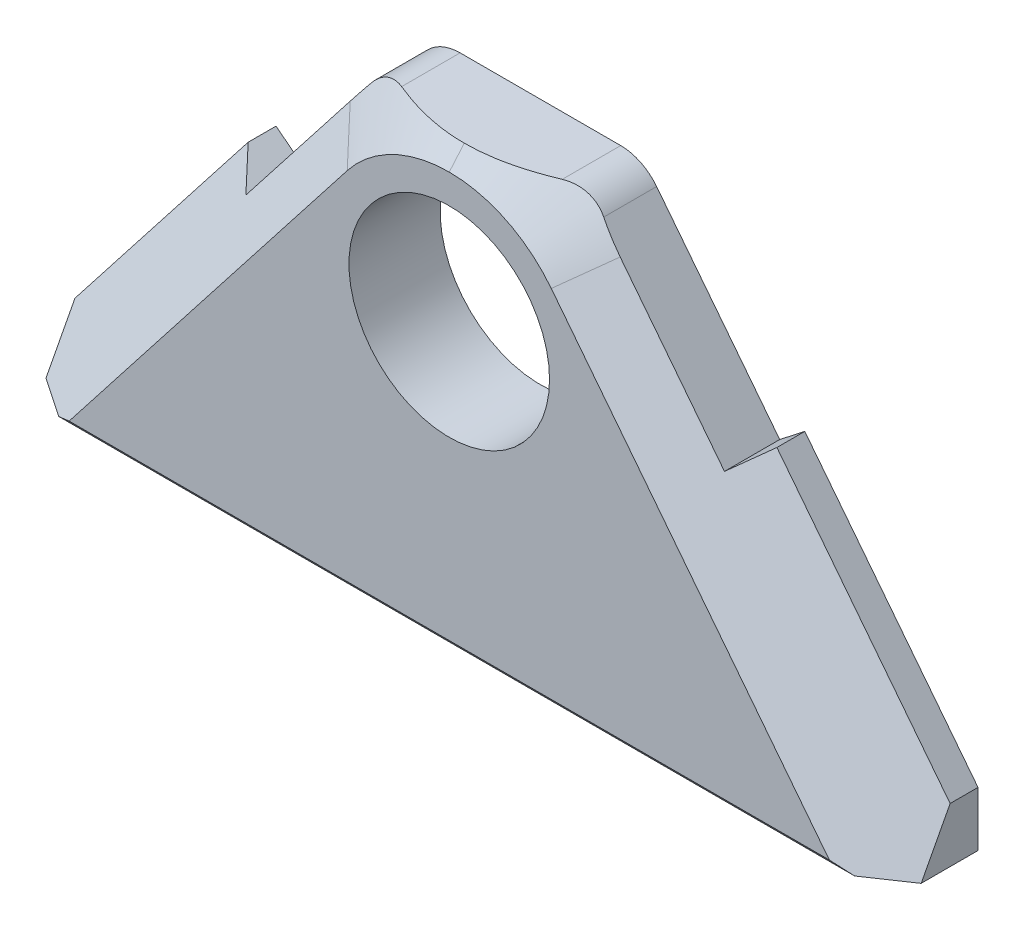
ISO-10303-21;
HEADER;
FILE_DESCRIPTION(('STEP AP214'),'2;1');
FILE_NAME('part.step','',(''),(''),'','','');
FILE_SCHEMA(('AUTOMOTIVE_DESIGN { 1 0 10303 214 1 1 1 1 }'));
ENDSEC;
DATA;
#1=APPLICATION_CONTEXT('core data for automotive mechanical design processes');
#2=APPLICATION_PROTOCOL_DEFINITION('international standard','automotive_design',2000,#1);
#3=PRODUCT_CONTEXT('',#1,'mechanical');
#4=PRODUCT('Part','Part','',(#3));
#5=PRODUCT_RELATED_PRODUCT_CATEGORY('part','',(#4));
#6=PRODUCT_DEFINITION_FORMATION('','',#4);
#7=PRODUCT_DEFINITION_CONTEXT('part definition',#1,'design');
#8=PRODUCT_DEFINITION('design','',#6,#7);
#9=PRODUCT_DEFINITION_SHAPE('','',#8);
#10=(LENGTH_UNIT() NAMED_UNIT(*) SI_UNIT(.MILLI.,.METRE.));
#11=(NAMED_UNIT(*) PLANE_ANGLE_UNIT() SI_UNIT($,.RADIAN.));
#12=(NAMED_UNIT(*) SI_UNIT($,.STERADIAN.) SOLID_ANGLE_UNIT());
#13=UNCERTAINTY_MEASURE_WITH_UNIT(LENGTH_MEASURE(1.E-05),#10,'distance_accuracy_value','');
#14=(GEOMETRIC_REPRESENTATION_CONTEXT(3) GLOBAL_UNCERTAINTY_ASSIGNED_CONTEXT((#13)) GLOBAL_UNIT_ASSIGNED_CONTEXT((#10,
#11,#12)) REPRESENTATION_CONTEXT('',''));
#15=CARTESIAN_POINT('',(0.,0.,0.));
#16=DIRECTION('',(0.,0.,1.));
#17=DIRECTION('',(1.,0.,0.));
#18=AXIS2_PLACEMENT_3D('',#15,#16,#17);
#19=CARTESIAN_POINT('',(-17.6162885321092,-10.,20.));
#20=DIRECTION('',(0.,0.,-1.));
#21=DIRECTION('',(-1.,0.,0.));
#22=AXIS2_PLACEMENT_3D('',#19,#20,#21);
#23=PLANE('',#22);
#24=CARTESIAN_POINT('',(0.,-32.2471332158867,20.));
#25=DIRECTION('',(0.,0.,1.));
#26=DIRECTION('',(0.788010753606719,0.615661475325662,0.));
#27=AXIS2_PLACEMENT_3D('',#24,#25,#26);
#28=CIRCLE('',#27,28.4037479691433);
#29=CARTESIAN_POINT('',(22.38245884242,-14.7600398364257,20.));
#30=VERTEX_POINT('',#29);
#31=CARTESIAN_POINT('',(0.,-3.84338524674341,20.));
#32=VERTEX_POINT('',#31);
#33=EDGE_CURVE('E182',#30,#32,#28,.T.);
#34=ORIENTED_EDGE('',*,*,#33,.T.);
#35=CARTESIAN_POINT('',(0.,-32.2471332158867,20.));
#36=DIRECTION('',(0.,0.,1.));
#37=DIRECTION('',(0.,1.,0.));
#38=AXIS2_PLACEMENT_3D('',#35,#36,#37);
#39=CIRCLE('',#38,28.4037479691433);
#40=CARTESIAN_POINT('',(-22.38245884242,-14.7600398364257,20.));
#41=VERTEX_POINT('',#40);
#42=EDGE_CURVE('E181',#32,#41,#39,.T.);
#43=ORIENTED_EDGE('',*,*,#42,.T.);
#44=DIRECTION('',(-0.615661475325662,-0.788010753606719,0.));
#45=VECTOR('',#44,1.);
#46=CARTESIAN_POINT('',(-22.38245884242,-14.7600398364257,20.));
#47=LINE('',#46,#45);
#48=CARTESIAN_POINT('',(-83.3881376708586,-92.8437479691434,20.));
#49=VERTEX_POINT('',#48);
#50=EDGE_CURVE('E165',#41,#49,#47,.T.);
#51=ORIENTED_EDGE('',*,*,#50,.T.);
#52=DIRECTION('',(1.,0.,0.));
#53=VECTOR('',#52,1.);
#54=CARTESIAN_POINT('',(-161.81548745287,-92.8437479691434,20.));
#55=LINE('',#54,#53);
#56=CARTESIAN_POINT('',(83.3881376708586,-92.8437479691433,20.));
#57=VERTEX_POINT('',#56);
#58=EDGE_CURVE('E174',#49,#57,#55,.T.);
#59=ORIENTED_EDGE('',*,*,#58,.T.);
#60=DIRECTION('',(-0.615661475325663,0.788010753606719,0.));
#61=VECTOR('',#60,1.);
#62=CARTESIAN_POINT('',(131.672835543534,-154.645342974244,20.));
#63=LINE('',#62,#61);
#64=EDGE_CURVE('E57',#57,#30,#63,.T.);
#65=ORIENTED_EDGE('',*,*,#64,.T.);
#66=EDGE_LOOP('',(#34,#43,#51,#59,#65));
#67=FACE_BOUND('',#66,.T.);
#68=CARTESIAN_POINT('',(0.,-32.2471332158867,20.));
#69=DIRECTION('',(0.,0.,1.));
#70=DIRECTION('',(1.,0.,0.));
#71=AXIS2_PLACEMENT_3D('',#68,#69,#70);
#72=CIRCLE('',#71,22.);
#73=CARTESIAN_POINT('',(22.,-32.2471332158867,20.));
#74=VERTEX_POINT('',#73);
#75=EDGE_CURVE('E322',#74,#74,#72,.T.);
#76=ORIENTED_EDGE('',*,*,#75,.F.);
#77=EDGE_LOOP('',(#76));
#78=FACE_BOUND('',#77,.T.);
#79=ADVANCED_FACE('F36',(#67,#78),#23,.F.);
#80=CARTESIAN_POINT('',(52.5,-38.406422138337,20.));
#81=DIRECTION('',(0.615661475325664,-0.788010753606717,0.));
#82=DIRECTION('',(0.788010753606717,0.615661475325665,0.));
#83=AXIS2_PLACEMENT_3D('',#80,#81,#82);
#84=PLANE('',#83);
#85=DIRECTION('',(-0.597597344373302,-0.466894215597453,0.651833725300875));
#86=VECTOR('',#85,1.);
#87=CARTESIAN_POINT('',(49.4281398353338,-40.8064223316293,15.4646690258209));
#88=LINE('',#87,#86);
#89=CARTESIAN_POINT('',(58.,-34.10935119255,6.11484912367249));
#90=VERTEX_POINT('',#89);
#91=CARTESIAN_POINT('',(52.5,-38.406422138337,12.1140148209607));
#92=VERTEX_POINT('',#91);
#93=EDGE_CURVE('E196',#90,#92,#88,.T.);
#94=ORIENTED_EDGE('',*,*,#93,.F.);
#95=DIRECTION('',(0.,0.,-1.));
#96=VECTOR('',#95,1.);
#97=CARTESIAN_POINT('',(58.,-34.10935119255,20.));
#98=LINE('',#97,#96);
#99=CARTESIAN_POINT('',(58.,-34.10935119255,0.));
#100=VERTEX_POINT('',#99);
#101=EDGE_CURVE('E363',#90,#100,#98,.T.);
#102=ORIENTED_EDGE('',*,*,#101,.T.);
#103=DIRECTION('',(-0.788010753606717,-0.615661475325664,0.));
#104=VECTOR('',#103,1.);
#105=CARTESIAN_POINT('',(52.5,-38.406422138337,0.));
#106=LINE('',#105,#104);
#107=CARTESIAN_POINT('',(52.5,-38.406422138337,0.));
#108=VERTEX_POINT('',#107);
#109=EDGE_CURVE('E327',#100,#108,#106,.T.);
#110=ORIENTED_EDGE('',*,*,#109,.T.);
#111=DIRECTION('',(0.,0.,-1.));
#112=VECTOR('',#111,1.);
#113=CARTESIAN_POINT('',(52.5,-38.406422138337,20.));
#114=LINE('',#113,#112);
#115=EDGE_CURVE('E384',#92,#108,#114,.T.);
#116=ORIENTED_EDGE('',*,*,#115,.F.);
#117=EDGE_LOOP('',(#94,#102,#110,#116));
#118=FACE_BOUND('',#117,.T.);
#119=ADVANCED_FACE('F38',(#118),#84,.F.);
#120=CARTESIAN_POINT('',(25.4963960681764,-3.84338524674341,20.));
#121=DIRECTION('',(-0.788010753606721,-0.61566147532566,0.));
#122=DIRECTION('',(0.61566147532566,-0.788010753606721,0.));
#123=AXIS2_PLACEMENT_3D('',#120,#121,#122);
#124=PLANE('',#123);
#125=CARTESIAN_POINT('',(34.0255776457591,-14.7602398364257,11.5315974742086));
#126=CARTESIAN_POINT('',(33.6722314808253,-14.3079773693511,11.6240734914559));
#127=CARTESIAN_POINT('',(33.3178245509439,-13.8543571850582,11.706036705566));
#128=CARTESIAN_POINT('',(32.6073274857168,-12.9449624117231,11.8481745801376));
#129=CARTESIAN_POINT('',(32.2512371964869,-12.489187625718,11.9083472080069));
#130=CARTESIAN_POINT('',(31.5400585896001,-11.5789205188385,12.0058245211586));
#131=CARTESIAN_POINT('',(31.1849774572269,-11.1244373947078,12.0432667738957));
#132=CARTESIAN_POINT('',(30.474196874512,-10.2146797355366,12.0954047731606));
#133=CARTESIAN_POINT('',(30.1184974524634,-9.75940523670954,12.1101015344517));
#134=CARTESIAN_POINT('',(29.4070101757257,-8.84874305043733,12.116561853786));
#135=CARTESIAN_POINT('',(29.0512223189878,-8.39335536036966,12.1083248187951));
#136=CARTESIAN_POINT('',(28.3401109348873,-7.48317429473305,12.0690241537782));
#137=CARTESIAN_POINT('',(27.984787427853,-7.02838094518303,12.0379595558715));
#138=CARTESIAN_POINT('',(27.2729786096777,-6.11730720463821,11.9531173496334));
#139=CARTESIAN_POINT('',(26.9164995895706,-5.66103486579985,11.8992012527638));
#140=CARTESIAN_POINT('',(26.2050921002238,-4.75047480273081,11.7693499488767));
#141=CARTESIAN_POINT('',(25.8501635061166,-4.29618691867734,11.6934165495462));
#142=CARTESIAN_POINT('',(25.4962398110511,-3.84318524674341,11.6068254006756));
#143=B_SPLINE_CURVE_WITH_KNOTS('',3,(#125,#126,#127,#128,#129,#130,#131,#132,#133,#134,#135,
#136,#137,#138,#139,#140,#141,#142),.UNSPECIFIED.,.F.,.F.,(4,2,2,2,2,2,2,2,4),(0.,
1.74394100559541,3.48804464145281,5.22148465695768,6.95484733485376,8.68825483536125,
10.4217358359768,12.1658760730406,13.9098731514543),.UNSPECIFIED.);
#144=CARTESIAN_POINT('',(29.6122839003148,-9.11148143653425,12.1140148209605));
#145=VERTEX_POINT('',#144);
#146=CARTESIAN_POINT('',(25.4963960681764,-3.84338524674341,11.6068636111043));
#147=VERTEX_POINT('',#146);
#148=EDGE_CURVE('E293',#145,#147,#143,.T.);
#149=ORIENTED_EDGE('',*,*,#148,.F.);
#150=DIRECTION('',(-0.615661475325659,0.788010753606721,0.));
#151=VECTOR('',#150,1.);
#152=CARTESIAN_POINT('',(25.4963960681765,-3.84338524674343,12.1140148209605));
#153=LINE('',#152,#151);
#154=EDGE_CURVE('E198',#92,#145,#153,.T.);
#155=ORIENTED_EDGE('',*,*,#154,.F.);
#156=ORIENTED_EDGE('',*,*,#115,.T.);
#157=DIRECTION('',(-0.61566147532566,0.788010753606721,0.));
#158=VECTOR('',#157,1.);
#159=CARTESIAN_POINT('',(25.4963960681764,-3.84338524674341,0.));
#160=LINE('',#159,#158);
#161=CARTESIAN_POINT('',(25.4963960681764,-3.84338524674341,0.));
#162=VERTEX_POINT('',#161);
#163=EDGE_CURVE('E331',#108,#162,#160,.T.);
#164=ORIENTED_EDGE('',*,*,#163,.T.);
#165=DIRECTION('',(0.,0.,-1.));
#166=VECTOR('',#165,1.);
#167=CARTESIAN_POINT('',(25.4963960681764,-3.84338524674341,20.));
#168=LINE('',#167,#166);
#169=EDGE_CURVE('E318',#147,#162,#168,.T.);
#170=ORIENTED_EDGE('',*,*,#169,.F.);
#171=EDGE_LOOP('',(#149,#155,#156,#164,#170));
#172=FACE_BOUND('',#171,.T.);
#173=ADVANCED_FACE('F303',(#172),#124,.F.);
#174=CARTESIAN_POINT('',(17.6162885321092,-10.,20.));
#175=DIRECTION('',(0.,0.,-1.));
#176=DIRECTION('',(-1.,0.,0.));
#177=AXIS2_PLACEMENT_3D('',#174,#175,#176);
#178=CYLINDRICAL_SURFACE('',#177,9.99999999999999);
#179=CARTESIAN_POINT('',(25.4965523212145,-3.84358524674341,11.6069018224736));
#180=CARTESIAN_POINT('',(25.3502206727054,-3.65621443231417,11.5710869033903));
#181=CARTESIAN_POINT('',(25.1966488358205,-3.4734753130692,11.5405130364375));
#182=CARTESIAN_POINT('',(24.876028705737,-3.118638283721,11.4900733473774));
#183=CARTESIAN_POINT('',(24.7089797130194,-2.94654092678826,11.4702080815013));
#184=CARTESIAN_POINT('',(24.3628124602949,-2.61475673500187,11.4414475270443));
#185=CARTESIAN_POINT('',(24.183722052654,-2.45504298314484,11.4325277831986));
#186=CARTESIAN_POINT('',(23.8144021738536,-2.14882744967508,11.4256654796388));
#187=CARTESIAN_POINT('',(23.6241733913691,-2.0023248526491,11.4277222419653));
#188=CARTESIAN_POINT('',(23.2337904880058,-1.72345069736044,11.442797741564));
#189=CARTESIAN_POINT('',(23.0336278969378,-1.59109151269696,11.4558259903604));
#190=CARTESIAN_POINT('',(22.6250384410476,-1.3414932625049,11.4927207579832));
#191=CARTESIAN_POINT('',(22.4166112031095,-1.22425488063879,11.5165877666461));
#192=CARTESIAN_POINT('',(21.9930380328594,-1.00550746313155,11.5749230854778));
#193=CARTESIAN_POINT('',(21.7778905240163,-0.904002152172995,11.6093939002681));
#194=CARTESIAN_POINT('',(21.3425423822678,-0.717158651221527,11.6885943310787));
#195=CARTESIAN_POINT('',(21.1223418928795,-0.631820002691255,11.7333236560559));
#196=CARTESIAN_POINT('',(20.6767438676816,-0.476886581108399,11.833010301801));
#197=CARTESIAN_POINT('',(20.4513192207698,-0.407419523171463,11.8880445237951));
#198=CARTESIAN_POINT('',(19.9985036849169,-0.285060029341148,12.0076212708451));
#199=CARTESIAN_POINT('',(19.7711127096231,-0.232168325202837,12.0721642154994));
#200=CARTESIAN_POINT('',(19.3160380278976,-0.142789972389602,12.2101651874482));
#201=CARTESIAN_POINT('',(19.0883546943898,-0.1062904029484,12.2836161349812));
#202=CARTESIAN_POINT('',(18.6339369580006,-0.0492816313263727,12.4388964970625));
#203=CARTESIAN_POINT('',(18.4072022079582,-0.0287659550710218,12.5207225041889));
#204=CARTESIAN_POINT('',(18.0868181232708,-0.0106247877639604,12.6424408605652));
#205=CARTESIAN_POINT('',(17.9922614498806,-0.00662452319695284,12.6791249423715));
#206=CARTESIAN_POINT('',(17.8037468728927,-0.0013134208178163,12.7537738507775));
#207=CARTESIAN_POINT('',(17.7097882729568,1.53604201962529E-06,12.7917366248922));
#208=CARTESIAN_POINT('',(17.6160885321092,-1.9999980020526E-09,12.8303486251592));
#209=B_SPLINE_CURVE_WITH_KNOTS('',3,(#179,#180,#181,#182,#183,#184,#185,#186,#187,#188,#189,
#190,#191,#192,#193,#194,#195,#196,#197,#198,#199,#200,#201,#202,#203,#204,#205,#206,#207,#208),
.UNSPECIFIED.,.F.,.F.,(4,2,2,2,2,2,2,2,2,2,2,2,2,2,4),(0.,0.721087413667939,1.44221227879583,
2.16172300446071,2.88118929035254,3.60127994689471,4.32140314975865,5.04169657666608,
5.76196957072811,6.48784891934989,7.21376030898247,7.93909850515977,8.66414275928604,
8.96861318006386,9.27261621564033),.UNSPECIFIED.);
#210=CARTESIAN_POINT('',(17.6162885321092,0.,12.8302662094658));
#211=VERTEX_POINT('',#210);
#212=EDGE_CURVE('E287',#147,#211,#209,.T.);
#213=ORIENTED_EDGE('',*,*,#212,.F.);
#214=ORIENTED_EDGE('',*,*,#169,.T.);
#215=CARTESIAN_POINT('',(17.6162885321092,-10.,0.));
#216=DIRECTION('',(0.,0.,1.));
#217=DIRECTION('',(-1.,0.,0.));
#218=AXIS2_PLACEMENT_3D('',#215,#216,#217);
#219=CIRCLE('',#218,9.99999999999999);
#220=CARTESIAN_POINT('',(17.6162885321092,0.,0.));
#221=VERTEX_POINT('',#220);
#222=EDGE_CURVE('E333',#162,#221,#219,.T.);
#223=ORIENTED_EDGE('',*,*,#222,.T.);
#224=DIRECTION('',(0.,0.,-1.));
#225=VECTOR('',#224,1.);
#226=CARTESIAN_POINT('',(17.6162885321092,0.,20.));
#227=LINE('',#226,#225);
#228=EDGE_CURVE('E381',#211,#221,#227,.T.);
#229=ORIENTED_EDGE('',*,*,#228,.F.);
#230=EDGE_LOOP('',(#213,#214,#223,#229));
#231=FACE_BOUND('',#230,.T.);
#232=ADVANCED_FACE('F299',(#231),#178,.T.);
#233=CARTESIAN_POINT('',(-17.6162885321092,0.,20.));
#234=DIRECTION('',(0.,-1.,0.));
#235=DIRECTION('',(0.,0.,-1.));
#236=AXIS2_PLACEMENT_3D('',#233,#234,#235);
#237=PLANE('',#236);
#238=CARTESIAN_POINT('',(26.6522847523514,0.,8.45489378750545));
#239=CARTESIAN_POINT('',(26.2096172289725,0.,8.6972801172418));
#240=CARTESIAN_POINT('',(25.7654400478303,0.,8.93692457365816));
#241=CARTESIAN_POINT('',(24.8738608979515,0.,9.41018901425121));
#242=CARTESIAN_POINT('',(24.4264587702086,0.,9.64380869873999));
#243=CARTESIAN_POINT('',(23.5280001638039,0.,10.1045961449482));
#244=CARTESIAN_POINT('',(23.076941663653,0.,10.331759973116));
#245=CARTESIAN_POINT('',(22.1712648389881,0.,10.7788511048338));
#246=CARTESIAN_POINT('',(21.7166465571174,0.,10.9987784949066));
#247=CARTESIAN_POINT('',(20.3380287895517,0.,11.6510232847803));
#248=CARTESIAN_POINT('',(19.4082153699417,0.,12.0711814949545));
#249=CARTESIAN_POINT('',(17.5320855766408,0.,12.8726559703602));
#250=CARTESIAN_POINT('',(16.5857717876539,0.,13.2539782561598));
#251=CARTESIAN_POINT('',(14.6857975372187,0.,13.966283436284));
#252=CARTESIAN_POINT('',(13.7323244369063,0.,14.2977619280966));
#253=CARTESIAN_POINT('',(11.8080797058283,0.,14.9067256796299));
#254=CARTESIAN_POINT('',(10.8373068043253,0.,15.1842069550536));
#255=CARTESIAN_POINT('',(8.88352069397177,0.,15.6751454882795));
#256=CARTESIAN_POINT('',(7.90057150321788,0.,15.8888529316822));
#257=CARTESIAN_POINT('',(6.41678643809575,0.,16.1561405287196));
#258=CARTESIAN_POINT('',(5.92065764235278,0.,16.2363546375884));
#259=CARTESIAN_POINT('',(4.92575955625536,0.,16.378174464788));
#260=CARTESIAN_POINT('',(4.4269904395963,0.,16.4397813920991));
#261=CARTESIAN_POINT('',(3.30971544400329,0.,16.5558736758321));
#262=CARTESIAN_POINT('',(2.6906723201793,0.,16.6052655109945));
#263=CARTESIAN_POINT('',(1.45095949555625,0.,16.6735517431646));
#264=CARTESIAN_POINT('',(0.830289944031917,0.,16.6924488471347));
#265=CARTESIAN_POINT('',(-0.411532923197389,0.,16.6993838767964));
#266=CARTESIAN_POINT('',(-1.03268632606942,0.,16.6874064717769));
#267=CARTESIAN_POINT('',(-2.27365093706909,0.,16.632796920197));
#268=CARTESIAN_POINT('',(-2.89346211245669,0.,16.5901640341411));
#269=CARTESIAN_POINT('',(-4.12702520159881,0.,16.4753737664601));
#270=CARTESIAN_POINT('',(-4.74079182725409,0.,16.4033735644651));
#271=CARTESIAN_POINT('',(-5.96432746778747,0.,16.2311700076552));
#272=CARTESIAN_POINT('',(-6.57409652483327,0.,16.1309669508248));
#273=CARTESIAN_POINT('',(-7.78862546302548,0.,15.9040474363566));
#274=CARTESIAN_POINT('',(-8.3933856196168,0.,15.7773324468385));
#275=CARTESIAN_POINT('',(-9.59729334795566,0.,15.4992956087974));
#276=CARTESIAN_POINT('',(-10.1964399313532,0.,15.347969510148));
#277=CARTESIAN_POINT('',(-11.7228797152852,0.,14.9315619171904));
#278=CARTESIAN_POINT('',(-12.6457727413044,0.,14.6502771668836));
#279=CARTESIAN_POINT('',(-14.4757373142299,0.,14.0405614668322));
#280=CARTESIAN_POINT('',(-15.3828076898774,0.,13.7121270433414));
#281=CARTESIAN_POINT('',(-17.1822040825285,0.,13.0150285827768));
#282=CARTESIAN_POINT('',(-18.0745161246408,0.,12.646328677117));
#283=CARTESIAN_POINT('',(-19.8443593591917,0.,11.8753207119862));
#284=CARTESIAN_POINT('',(-20.721891322285,0.,11.4730144113609));
#285=CARTESIAN_POINT('',(-22.4725470941988,0.,10.6357990602053));
#286=CARTESIAN_POINT('',(-23.3455277246312,0.,10.200591881894));
#287=CARTESIAN_POINT('',(-25.0789689677475,0.,9.30598950995736));
#288=CARTESIAN_POINT('',(-25.9394294704145,0.,8.8465941039491));
#289=CARTESIAN_POINT('',(-27.6487230850945,0.,7.90766395437525));
#290=CARTESIAN_POINT('',(-28.4975615653771,0.,7.42813895566932));
#291=CARTESIAN_POINT('',(-30.185253366753,0.,6.45187302664602));
#292=CARTESIAN_POINT('',(-31.0241066885939,0.,5.95513209761796));
#293=CARTESIAN_POINT('',(-32.9248435108217,0.,4.80693712856482));
#294=CARTESIAN_POINT('',(-33.9839255658079,0.,4.15084994065937));
#295=CARTESIAN_POINT('',(-36.089677190163,0.,2.81909394509966));
#296=CARTESIAN_POINT('',(-37.1363466565221,0.,2.14342497509985));
#297=CARTESIAN_POINT('',(-39.2022941054754,0.,0.786848733323608));
#298=CARTESIAN_POINT('',(-40.2217420255641,0.,0.106199898478608));
#299=CARTESIAN_POINT('',(-41.7441639503455,0.,-0.924610980234595));
#300=CARTESIAN_POINT('',(-42.2504899878671,0.,-1.26983823712391));
#301=CARTESIAN_POINT('',(-43.2610563072245,0.,-1.96332191093491));
#302=CARTESIAN_POINT('',(-43.7652966098013,0.,-2.31157829762671));
#303=CARTESIAN_POINT('',(-44.2685732844607,0.,-2.66122274553415));
#304=B_SPLINE_CURVE_WITH_KNOTS('',3,(#238,#239,#240,#241,#242,#243,#244,#245,#246,#247,#248,
#249,#250,#251,#252,#253,#254,#255,#256,#257,#258,#259,#260,#261,#262,#263,#264,#265,#266,#267,
#268,#269,#270,#271,#272,#273,#274,#275,#276,#277,#278,#279,#280,#281,#282,#283,#284,#285,#286,
#287,#288,#289,#290,#291,#292,#293,#294,#295,#296,#297,#298,#299,#300,#301,#302,#303),
.UNSPECIFIED.,.F.,.F.,(4,2,2,2,2,2,2,2,2,2,2,2,2,2,2,2,2,2,2,2,2,2,2,2,2,2,2,2,2,2,2,2,4),(0.,
1.51405175069076,3.02817866957884,4.54320918244116,6.05822157418501,9.11844748203158,
12.1781982516358,15.2051644457471,18.232353906245,21.2475066400117,22.7549238534469,
24.2622431030958,26.124521676217,27.9866349291228,29.8496729908693,31.7127559957846,
33.565995597751,35.419215619575,37.2723330449978,39.1257708283011,42.0185907013386,
44.9116238119844,47.8072553950368,50.7027355253205,53.6286365608672,56.5545632913598,
59.4790895390242,62.4036155676669,66.1408460197765,69.8781074647988,73.5553431044185,
75.3937931902939,77.232224949949),.UNSPECIFIED.);
#305=CARTESIAN_POINT('',(0.,0.,16.6965006118518));
#306=VERTEX_POINT('',#305);
#307=CARTESIAN_POINT('',(-17.6162885321092,0.,12.8302662094658));
#308=VERTEX_POINT('',#307);
#309=EDGE_CURVE('E216',#306,#308,#304,.T.);
#310=ORIENTED_EDGE('',*,*,#309,.F.);
#311=CARTESIAN_POINT('',(44.2685732844607,0.,-2.66122274553415));
#312=CARTESIAN_POINT('',(43.7989322659409,0.,-2.33494544072392));
#313=CARTESIAN_POINT('',(43.3284515813793,0.,-2.00987755288572));
#314=CARTESIAN_POINT('',(42.3856835073702,0.,-1.36236498702683));
#315=CARTESIAN_POINT('',(41.9133961041445,0.,-1.03992032907018));
#316=CARTESIAN_POINT('',(40.4935558938186,0.,-0.0767757694114227));
#317=CARTESIAN_POINT('',(39.5431120169461,0.,0.559674215380693));
#318=CARTESIAN_POINT('',(37.6308206469058,0.,1.82092458299759));
#319=CARTESIAN_POINT('',(36.668949251032,0.,2.44568877178407));
#320=CARTESIAN_POINT('',(34.735038994209,0.,3.6792480993368));
#321=CARTESIAN_POINT('',(33.7630004237131,0.,4.28804369255624));
#322=CARTESIAN_POINT('',(31.7646557117793,0.,5.51260426341787));
#323=CARTESIAN_POINT('',(30.7378281114027,0.,6.12752065810352));
#324=CARTESIAN_POINT('',(28.6693269638182,0.,7.33208251943809));
#325=CARTESIAN_POINT('',(27.6276526216962,0.,7.92172662615096));
#326=CARTESIAN_POINT('',(25.5282943312428,0.,9.06937632043036));
#327=CARTESIAN_POINT('',(24.4706272034649,0.,9.62741256806459));
#328=CARTESIAN_POINT('',(22.3359466758917,0.,10.7051245735865));
#329=CARTESIAN_POINT('',(21.258936058787,0.,11.2248057950079));
#330=CARTESIAN_POINT('',(19.5798574467447,0.,11.9901442911223));
#331=CARTESIAN_POINT('',(18.985426907205,0.,12.252592766023));
#332=CARTESIAN_POINT('',(17.7898285169301,0.,12.7616332315927));
#333=CARTESIAN_POINT('',(17.1886609931385,0.,13.0082259878548));
#334=CARTESIAN_POINT('',(15.9792192748015,0.,13.4836529584445));
#335=CARTESIAN_POINT('',(15.3709441900842,0.,13.7124849203256));
#336=CARTESIAN_POINT('',(14.1473008203798,0.,14.1501991965719));
#337=CARTESIAN_POINT('',(13.5319325217401,0.,14.3590814725317));
#338=CARTESIAN_POINT('',(11.691868699401,0.,14.946993676377));
#339=CARTESIAN_POINT('',(10.4565203700818,0.,15.2939688081076));
#340=CARTESIAN_POINT('',(8.58519749825303,0.,15.7356656122353));
#341=CARTESIAN_POINT('',(7.95834198967209,0.,15.8697748711821));
#342=CARTESIAN_POINT('',(6.6991609748562,0.,16.1096252601764));
#343=CARTESIAN_POINT('',(6.06683546785724,0.,16.2153663862618));
#344=CARTESIAN_POINT('',(4.78651943260542,0.,16.3981742470537));
#345=CARTESIAN_POINT('',(4.13845071014881,0.,16.4746956718768));
#346=CARTESIAN_POINT('',(2.83925082880438,0.,16.5948097544387));
#347=CARTESIAN_POINT('',(2.18811968235353,0.,16.6384025457897));
#348=CARTESIAN_POINT('',(0.884516971920011,0.,16.6917226070834));
#349=CARTESIAN_POINT('',(0.232045521730509,0.,16.7014526420229));
#350=CARTESIAN_POINT('',(-1.07251501535233,0.,16.6868416848347));
#351=CARTESIAN_POINT('',(-1.7246041009256,0.,16.6625005757653));
#352=CARTESIAN_POINT('',(-3.03359767943944,0.,16.5798384775244));
#353=CARTESIAN_POINT('',(-3.69047934094065,0.,16.5211577964412));
#354=CARTESIAN_POINT('',(-5.00043403590598,0.,16.3707926157631));
#355=CARTESIAN_POINT('',(-5.65350704424994,0.,16.2791078987382));
#356=CARTESIAN_POINT('',(-6.95456511229866,0.,16.0645551589893));
#357=CARTESIAN_POINT('',(-7.6025495324949,0.,15.9416832794851));
#358=CARTESIAN_POINT('',(-8.89232899680188,0.,15.6669944486348));
#359=CARTESIAN_POINT('',(-9.53412392228721,0.,15.5151769436819));
#360=CARTESIAN_POINT('',(-10.9010996589672,0.,15.1617039817377));
#361=CARTESIAN_POINT('',(-11.6252410419019,0.,14.9560370002592));
#362=CARTESIAN_POINT('',(-13.0641269760711,0.,14.5138821263838));
#363=CARTESIAN_POINT('',(-13.7788698869515,0.,14.2773889303443));
#364=CARTESIAN_POINT('',(-15.1992693715118,0.,13.7770302230605));
#365=CARTESIAN_POINT('',(-15.9049187327599,0.,13.5131443272146));
#366=CARTESIAN_POINT('',(-17.3067309708352,0.,12.9615199618046));
#367=CARTESIAN_POINT('',(-18.0028945740522,0.,12.6737833307449));
#368=CARTESIAN_POINT('',(-19.3746413304652,0.,12.0824384867509));
#369=CARTESIAN_POINT('',(-20.0503739940889,0.,11.7791758616619));
#370=CARTESIAN_POINT('',(-21.3936530489871,0.,11.1549995123184));
#371=CARTESIAN_POINT('',(-22.0611990727466,0.,10.834084999156));
#372=CARTESIAN_POINT('',(-23.386769862222,0.,10.1777666037404));
#373=CARTESIAN_POINT('',(-24.0448161197361,0.,9.84240599338961));
#374=CARTESIAN_POINT('',(-25.3537464667855,0.,9.15826571783344));
#375=CARTESIAN_POINT('',(-26.0046318720319,0.,8.8094885725374));
#376=CARTESIAN_POINT('',(-26.6522847523514,0.,8.45489378750545));
#377=B_SPLINE_CURVE_WITH_KNOTS('',3,(#311,#312,#313,#314,#315,#316,#317,#318,#319,#320,#321,
#322,#323,#324,#325,#326,#327,#328,#329,#330,#331,#332,#333,#334,#335,#336,#337,#338,#339,#340,
#341,#342,#343,#344,#345,#346,#347,#348,#349,#350,#351,#352,#353,#354,#355,#356,#357,#358,#359,
#360,#361,#362,#363,#364,#365,#366,#367,#368,#369,#370,#371,#372,#373,#374,#375,#376),
.UNSPECIFIED.,.F.,.F.,(4,2,2,2,2,2,2,2,2,2,2,2,2,2,2,2,2,2,2,2,2,2,2,2,2,2,2,2,2,2,2,2,4),(0.,
1.71556516790618,3.43114344517559,6.86261771960872,10.3033798029083,13.7440438584504,
17.3343586755003,20.9248664503103,24.5118295383003,28.0982806863486,30.0474597667743,
31.9965446603383,33.9458763367973,35.895211765869,39.7400419963609,41.6626454793234,
43.5852492308222,45.5421584534923,47.4990597357083,49.4558012272455,51.4125494348876,
53.3901701692912,55.3678039324695,57.3456823802407,59.3235986602177,61.5811554146212,
63.8391010950599,66.098739264699,68.3582034146295,70.5799091962131,72.8017143522828,
75.0172731265035,77.232417784445),.UNSPECIFIED.);
#378=EDGE_CURVE('E11',#211,#306,#377,.T.);
#379=ORIENTED_EDGE('',*,*,#378,.F.);
#380=ORIENTED_EDGE('',*,*,#228,.T.);
#381=DIRECTION('',(-1.,0.,0.));
#382=VECTOR('',#381,1.);
#383=CARTESIAN_POINT('',(-17.6162885321092,0.,0.));
#384=LINE('',#383,#382);
#385=CARTESIAN_POINT('',(-17.6162885321092,0.,0.));
#386=VERTEX_POINT('',#385);
#387=EDGE_CURVE('E336',#221,#386,#384,.T.);
#388=ORIENTED_EDGE('',*,*,#387,.T.);
#389=DIRECTION('',(0.,0.,-1.));
#390=VECTOR('',#389,1.);
#391=CARTESIAN_POINT('',(-17.6162885321092,0.,20.));
#392=LINE('',#391,#390);
#393=EDGE_CURVE('E379',#308,#386,#392,.T.);
#394=ORIENTED_EDGE('',*,*,#393,.F.);
#395=EDGE_LOOP('',(#310,#379,#380,#388,#394));
#396=FACE_BOUND('',#395,.T.);
#397=ADVANCED_FACE('F302',(#396),#237,.F.);
#398=CARTESIAN_POINT('',(-17.6162885321092,-10.,20.));
#399=DIRECTION('',(0.,0.,-1.));
#400=DIRECTION('',(-1.,0.,0.));
#401=AXIS2_PLACEMENT_3D('',#398,#399,#400);
#402=CYLINDRICAL_SURFACE('',#401,9.99999999999999);
#403=CARTESIAN_POINT('',(-17.6160885321092,-2.00000147928275E-09,12.8303486251592));
#404=CARTESIAN_POINT('',(-17.8564998150723,2.92633638788512E-05,12.7312661769081));
#405=CARTESIAN_POINT('',(-18.0987287295752,-0.00866011889031469,12.636438380756));
#406=CARTESIAN_POINT('',(-18.5854188949215,-0.0440858647883125,12.4559452438111));
#407=CARTESIAN_POINT('',(-18.8298813329671,-0.0708324522098109,12.3702851254984));
#408=CARTESIAN_POINT('',(-19.3198467181883,-0.143055487724995,12.2087337957037));
#409=CARTESIAN_POINT('',(-19.5653507678887,-0.188569104337648,12.132862364663));
#410=CARTESIAN_POINT('',(-20.0551024475804,-0.298703180446654,11.9917923164247));
#411=CARTESIAN_POINT('',(-20.2993503011043,-0.363320111868324,11.9265917319448));
#412=CARTESIAN_POINT('',(-20.7858092940224,-0.512159530076064,11.8072307354021));
#413=CARTESIAN_POINT('',(-21.0280067445346,-0.596467024416512,11.7531201587785));
#414=CARTESIAN_POINT('',(-21.5072542210804,-0.7844350426588,11.6568817493344));
#415=CARTESIAN_POINT('',(-21.7443038889151,-0.888096908512449,11.6147547479166));
#416=CARTESIAN_POINT('',(-22.2106902290333,-1.11414098019637,11.543043248753));
#417=CARTESIAN_POINT('',(-22.4400412251538,-1.23648576577912,11.5134341159169));
#418=CARTESIAN_POINT('',(-22.8894401974031,-1.49931652971823,11.4669952595213));
#419=CARTESIAN_POINT('',(-23.1094889995418,-1.63980089281803,11.450164399025));
#420=CARTESIAN_POINT('',(-23.5292123778568,-1.93155185273661,11.4299248139669));
#421=CARTESIAN_POINT('',(-23.7293552960099,-2.08210779730337,11.4259767581793));
#422=CARTESIAN_POINT('',(-24.1177068768644,-2.39775156402735,11.4300274111139));
#423=CARTESIAN_POINT('',(-24.3059151495752,-2.56283986064038,11.438026510026));
#424=CARTESIAN_POINT('',(-24.6699469385777,-2.90711821782409,11.4659607385537));
#425=CARTESIAN_POINT('',(-24.8456996719898,-3.08637825746232,11.485958786484));
#426=CARTESIAN_POINT('',(-25.0982356593806,-3.36402637305482,11.5247628233652));
#427=CARTESIAN_POINT('',(-25.1805750641302,-3.45804771568453,11.5391676800748));
#428=CARTESIAN_POINT('',(-25.3414448151352,-3.64881696331849,11.5708730271814));
#429=CARTESIAN_POINT('',(-25.4199752684204,-3.74556479158882,11.5881734361537));
#430=CARTESIAN_POINT('',(-25.4965523212145,-3.84358524674341,11.6069018224736));
#431=B_SPLINE_CURVE_WITH_KNOTS('',3,(#403,#404,#405,#406,#407,#408,#409,#410,#411,#412,#413,
#414,#415,#416,#417,#418,#419,#420,#421,#422,#423,#424,#425,#426,#427,#428,#429,#430),
.UNSPECIFIED.,.F.,.F.,(4,2,2,2,2,2,2,2,2,2,2,2,2,4),(0.,0.779987428051093,1.56041684660678,
2.34239940416199,3.12423763225071,3.90951570600974,4.69484824792533,5.47862798337874,
6.26233797446216,7.0127866116148,7.76325975869328,8.51770294416962,8.89501883489881,
9.27232411707293),.UNSPECIFIED.);
#432=CARTESIAN_POINT('',(-25.4963960681764,-3.84338524674341,11.6068636111043));
#433=VERTEX_POINT('',#432);
#434=EDGE_CURVE('E208',#308,#433,#431,.T.);
#435=ORIENTED_EDGE('',*,*,#434,.F.);
#436=ORIENTED_EDGE('',*,*,#393,.T.);
#437=CARTESIAN_POINT('',(-17.6162885321092,-10.,0.));
#438=DIRECTION('',(0.,0.,1.));
#439=DIRECTION('',(-1.,0.,0.));
#440=AXIS2_PLACEMENT_3D('',#437,#438,#439);
#441=CIRCLE('',#440,9.99999999999999);
#442=CARTESIAN_POINT('',(-25.4963960681764,-3.84338524674341,0.));
#443=VERTEX_POINT('',#442);
#444=EDGE_CURVE('E339',#386,#443,#441,.T.);
#445=ORIENTED_EDGE('',*,*,#444,.T.);
#446=DIRECTION('',(0.,0.,-1.));
#447=VECTOR('',#446,1.);
#448=CARTESIAN_POINT('',(-25.4963960681764,-3.84338524674341,20.));
#449=LINE('',#448,#447);
#450=EDGE_CURVE('E377',#433,#443,#449,.T.);
#451=ORIENTED_EDGE('',*,*,#450,.F.);
#452=EDGE_LOOP('',(#435,#436,#445,#451));
#453=FACE_BOUND('',#452,.T.);
#454=ADVANCED_FACE('F222',(#453),#402,.T.);
#455=CARTESIAN_POINT('',(-25.4963960681764,-3.84338524674341,20.));
#456=DIRECTION('',(0.788010753606721,-0.61566147532566,0.));
#457=DIRECTION('',(0.61566147532566,0.788010753606721,0.));
#458=AXIS2_PLACEMENT_3D('',#455,#456,#457);
#459=PLANE('',#458);
#460=CARTESIAN_POINT('',(-25.4962398110511,-3.84318524674341,11.6068254006756));
#461=CARTESIAN_POINT('',(-25.8501635061166,-4.29618691867734,11.6934165495462));
#462=CARTESIAN_POINT('',(-26.2050921002238,-4.75047480273081,11.7693499488767));
#463=CARTESIAN_POINT('',(-26.9164995895707,-5.66103486579986,11.8992012527638));
#464=CARTESIAN_POINT('',(-27.2729786096777,-6.11730720463822,11.9531173496335));
#465=CARTESIAN_POINT('',(-27.9847874278531,-7.02838094518304,12.0379595558715));
#466=CARTESIAN_POINT('',(-28.3401109348873,-7.48317429473306,12.0690241537782));
#467=CARTESIAN_POINT('',(-29.0512223189878,-8.39335536036968,12.1083248187951));
#468=CARTESIAN_POINT('',(-29.4070101757258,-8.84874305043734,12.1165618537859));
#469=CARTESIAN_POINT('',(-30.1184974524634,-9.75940523670956,12.1101015344517));
#470=CARTESIAN_POINT('',(-30.474196874512,-10.2146797355366,12.0954047731606));
#471=CARTESIAN_POINT('',(-31.1849774572269,-11.1244373947078,12.0432667738957));
#472=CARTESIAN_POINT('',(-31.5400585896001,-11.5789205188385,12.0058245211586));
#473=CARTESIAN_POINT('',(-32.2512371964869,-12.489187625718,11.9083472080069));
#474=CARTESIAN_POINT('',(-32.6073274857168,-12.9449624117231,11.8481745801376));
#475=CARTESIAN_POINT('',(-33.3178245509439,-13.8543571850582,11.706036705566));
#476=CARTESIAN_POINT('',(-33.6722314808253,-14.3079773693512,11.6240734914559));
#477=CARTESIAN_POINT('',(-34.0255776457591,-14.7602398364257,11.5315974742086));
#478=B_SPLINE_CURVE_WITH_KNOTS('',3,(#460,#461,#462,#463,#464,#465,#466,#467,#468,#469,#470,
#471,#472,#473,#474,#475,#476,#477),.UNSPECIFIED.,.F.,.F.,(4,2,2,2,2,2,2,2,4),(0.,
1.74399707841363,3.48813731547753,5.22161831609303,6.95502581660053,8.68838849449661,
10.4218285100015,12.1659321458589,13.9098731514543),.UNSPECIFIED.);
#479=CARTESIAN_POINT('',(-29.6122839003148,-9.11148143653425,12.1140148209605));
#480=VERTEX_POINT('',#479);
#481=EDGE_CURVE('E50',#433,#480,#478,.T.);
#482=ORIENTED_EDGE('',*,*,#481,.F.);
#483=ORIENTED_EDGE('',*,*,#450,.T.);
#484=DIRECTION('',(-0.61566147532566,-0.788010753606721,0.));
#485=VECTOR('',#484,1.);
#486=CARTESIAN_POINT('',(-25.4963960681764,-3.84338524674341,0.));
#487=LINE('',#486,#485);
#488=CARTESIAN_POINT('',(-52.5,-38.4064221383369,0.));
#489=VERTEX_POINT('',#488);
#490=EDGE_CURVE('E342',#443,#489,#487,.T.);
#491=ORIENTED_EDGE('',*,*,#490,.T.);
#492=DIRECTION('',(0.,0.,-1.));
#493=VECTOR('',#492,1.);
#494=CARTESIAN_POINT('',(-52.5,-38.4064221383369,20.));
#495=LINE('',#494,#493);
#496=CARTESIAN_POINT('',(-52.5,-38.4064221383369,12.1140148209606));
#497=VERTEX_POINT('',#496);
#498=EDGE_CURVE('E375',#497,#489,#495,.T.);
#499=ORIENTED_EDGE('',*,*,#498,.F.);
#500=DIRECTION('',(-0.61566147532566,-0.78801075360672,0.));
#501=VECTOR('',#500,1.);
#502=CARTESIAN_POINT('',(-25.4963960681764,-3.84338524674342,12.1140148209605));
#503=LINE('',#502,#501);
#504=EDGE_CURVE('E206',#480,#497,#503,.T.);
#505=ORIENTED_EDGE('',*,*,#504,.F.);
#506=EDGE_LOOP('',(#482,#483,#491,#499,#505));
#507=FACE_BOUND('',#506,.T.);
#508=ADVANCED_FACE('F240',(#507),#459,.F.);
#509=CARTESIAN_POINT('',(-52.5,-38.4064221383369,20.));
#510=DIRECTION('',(-0.615661475325659,-0.788010753606722,0.));
#511=DIRECTION('',(0.788010753606722,-0.615661475325659,0.));
#512=AXIS2_PLACEMENT_3D('',#509,#510,#511);
#513=PLANE('',#512);
#514=DIRECTION('',(-0.597597344373305,0.466894215597449,-0.651833725300874));
#515=VECTOR('',#514,1.);
#516=CARTESIAN_POINT('',(-49.4281398353338,-40.8064223316292,15.4646690258209));
#517=LINE('',#516,#515);
#518=CARTESIAN_POINT('',(-58.,-34.10935119255,6.11484912367246));
#519=VERTEX_POINT('',#518);
#520=EDGE_CURVE('E204',#497,#519,#517,.T.);
#521=ORIENTED_EDGE('',*,*,#520,.F.);
#522=ORIENTED_EDGE('',*,*,#498,.T.);
#523=DIRECTION('',(-0.788010753606722,0.615661475325659,0.));
#524=VECTOR('',#523,1.);
#525=CARTESIAN_POINT('',(-52.5,-38.4064221383369,0.));
#526=LINE('',#525,#524);
#527=CARTESIAN_POINT('',(-58.,-34.10935119255,0.));
#528=VERTEX_POINT('',#527);
#529=EDGE_CURVE('E345',#489,#528,#526,.T.);
#530=ORIENTED_EDGE('',*,*,#529,.T.);
#531=DIRECTION('',(0.,0.,-1.));
#532=VECTOR('',#531,1.);
#533=CARTESIAN_POINT('',(-58.,-34.10935119255,20.));
#534=LINE('',#533,#532);
#535=EDGE_CURVE('E373',#519,#528,#534,.T.);
#536=ORIENTED_EDGE('',*,*,#535,.F.);
#537=EDGE_LOOP('',(#521,#522,#530,#536));
#538=FACE_BOUND('',#537,.T.);
#539=ADVANCED_FACE('F244',(#538),#513,.F.);
#540=CARTESIAN_POINT('',(-58.,-34.10935119255,20.));
#541=DIRECTION('',(0.788010753606721,-0.61566147532566,0.));
#542=DIRECTION('',(0.61566147532566,0.788010753606721,0.));
#543=AXIS2_PLACEMENT_3D('',#540,#541,#542);
#544=PLANE('',#543);
#545=DIRECTION('',(-0.61566147532566,-0.788010753606721,0.));
#546=VECTOR('',#545,1.);
#547=CARTESIAN_POINT('',(-58.,-34.10935119255,6.11484912367246));
#548=LINE('',#547,#546);
#549=CARTESIAN_POINT('',(-96.,-82.7471332158868,6.11484912367263));
#550=VERTEX_POINT('',#549);
#551=EDGE_CURVE('E202',#519,#550,#548,.T.);
#552=ORIENTED_EDGE('',*,*,#551,.F.);
#553=ORIENTED_EDGE('',*,*,#535,.T.);
#554=DIRECTION('',(-0.61566147532566,-0.788010753606721,0.));
#555=VECTOR('',#554,1.);
#556=CARTESIAN_POINT('',(-58.,-34.10935119255,0.));
#557=LINE('',#556,#555);
#558=CARTESIAN_POINT('',(-96.,-82.7471332158868,0.));
#559=VERTEX_POINT('',#558);
#560=EDGE_CURVE('E348',#528,#559,#557,.T.);
#561=ORIENTED_EDGE('',*,*,#560,.T.);
#562=DIRECTION('',(0.,0.,-1.));
#563=VECTOR('',#562,1.);
#564=CARTESIAN_POINT('',(-96.,-82.7471332158868,20.));
#565=LINE('',#564,#563);
#566=EDGE_CURVE('E371',#550,#559,#565,.T.);
#567=ORIENTED_EDGE('',*,*,#566,.F.);
#568=EDGE_LOOP('',(#552,#553,#561,#567));
#569=FACE_BOUND('',#568,.T.);
#570=ADVANCED_FACE('F248',(#569),#544,.F.);
#571=CARTESIAN_POINT('',(-96.,-82.7471332158868,20.));
#572=DIRECTION('',(1.,0.,0.));
#573=DIRECTION('',(0.,0.,-1.));
#574=AXIS2_PLACEMENT_3D('',#571,#572,#573);
#575=PLANE('',#574);
#576=DIRECTION('',(0.,-0.883873113984593,0.467726756103581));
#577=VECTOR('',#576,1.);
#578=CARTESIAN_POINT('',(-96.,-88.4874087745852,9.15248023127241));
#579=LINE('',#578,#577);
#580=CARTESIAN_POINT('',(-96.,-94.7471332158868,12.4649925825456));
#581=VERTEX_POINT('',#580);
#582=EDGE_CURVE('E200',#550,#581,#579,.T.);
#583=ORIENTED_EDGE('',*,*,#582,.F.);
#584=ORIENTED_EDGE('',*,*,#566,.T.);
#585=DIRECTION('',(0.,-1.,0.));
#586=VECTOR('',#585,1.);
#587=CARTESIAN_POINT('',(-96.,-82.7471332158868,0.));
#588=LINE('',#587,#586);
#589=CARTESIAN_POINT('',(-96.,-94.7471332158868,0.));
#590=VERTEX_POINT('',#589);
#591=EDGE_CURVE('E351',#559,#590,#588,.T.);
#592=ORIENTED_EDGE('',*,*,#591,.T.);
#593=DIRECTION('',(0.,0.,-1.));
#594=VECTOR('',#593,1.);
#595=CARTESIAN_POINT('',(-96.,-94.7471332158868,20.));
#596=LINE('',#595,#594);
#597=EDGE_CURVE('E369',#581,#590,#596,.T.);
#598=ORIENTED_EDGE('',*,*,#597,.F.);
#599=EDGE_LOOP('',(#583,#584,#592,#598));
#600=FACE_BOUND('',#599,.T.);
#601=ADVANCED_FACE('F252',(#600),#575,.F.);
#602=CARTESIAN_POINT('',(96.,-94.7471332158868,20.));
#603=DIRECTION('',(0.,1.,0.));
#604=DIRECTION('',(0.,0.,1.));
#605=AXIS2_PLACEMENT_3D('',#602,#603,#604);
#606=PLANE('',#605);
#607=DIRECTION('',(0.827957751107617,0.,0.560790479930622));
#608=VECTOR('',#607,1.);
#609=CARTESIAN_POINT('',(39.117280730293,-94.7471332158868,103.982324966107));
#610=LINE('',#609,#608);
#611=CARTESIAN_POINT('',(-87.2906557542618,-94.7471332158867,18.3639860190038));
#612=VERTEX_POINT('',#611);
#613=EDGE_CURVE('E168',#581,#612,#610,.T.);
#614=ORIENTED_EDGE('',*,*,#613,.F.);
#615=ORIENTED_EDGE('',*,*,#597,.T.);
#616=DIRECTION('',(1.,0.,0.));
#617=VECTOR('',#616,1.);
#618=CARTESIAN_POINT('',(96.,-94.7471332158868,0.));
#619=LINE('',#618,#617);
#620=CARTESIAN_POINT('',(96.,-94.7471332158868,0.));
#621=VERTEX_POINT('',#620);
#622=EDGE_CURVE('E354',#590,#621,#619,.T.);
#623=ORIENTED_EDGE('',*,*,#622,.T.);
#624=DIRECTION('',(0.,0.,-1.));
#625=VECTOR('',#624,1.);
#626=CARTESIAN_POINT('',(96.,-94.7471332158868,20.));
#627=LINE('',#626,#625);
#628=CARTESIAN_POINT('',(96.,-94.7471332158868,12.4649925825457));
#629=VERTEX_POINT('',#628);
#630=EDGE_CURVE('E367',#629,#621,#627,.T.);
#631=ORIENTED_EDGE('',*,*,#630,.F.);
#632=DIRECTION('',(0.827957751107617,0.,-0.560790479930622));
#633=VECTOR('',#632,1.);
#634=CARTESIAN_POINT('',(92.5014144925901,-94.7471332158868,14.8346466417704));
#635=LINE('',#634,#633);
#636=CARTESIAN_POINT('',(87.2906557542623,-94.7471332158868,18.3639860190036));
#637=VERTEX_POINT('',#636);
#638=EDGE_CURVE('E194',#637,#629,#635,.T.);
#639=ORIENTED_EDGE('',*,*,#638,.F.);
#640=DIRECTION('',(1.,0.,0.));
#641=VECTOR('',#640,1.);
#642=CARTESIAN_POINT('',(96.,-94.7471332158868,18.3639860190037));
#643=LINE('',#642,#641);
#644=EDGE_CURVE('E387',#612,#637,#643,.T.);
#645=ORIENTED_EDGE('',*,*,#644,.F.);
#646=EDGE_LOOP('',(#614,#615,#623,#631,#639,#645));
#647=FACE_BOUND('',#646,.T.);
#648=ADVANCED_FACE('F256',(#647),#606,.F.);
#649=CARTESIAN_POINT('',(96.,-82.7471332158868,20.));
#650=DIRECTION('',(-1.,0.,0.));
#651=DIRECTION('',(0.,0.,1.));
#652=AXIS2_PLACEMENT_3D('',#649,#650,#651);
#653=PLANE('',#652);
#654=DIRECTION('',(0.,0.883873113984593,-0.467726756103582));
#655=VECTOR('',#654,1.);
#656=CARTESIAN_POINT('',(96.,-88.4874087745852,9.15248023127246));
#657=LINE('',#656,#655);
#658=CARTESIAN_POINT('',(96.,-82.7471332158868,6.11484912367259));
#659=VERTEX_POINT('',#658);
#660=EDGE_CURVE('E64',#629,#659,#657,.T.);
#661=ORIENTED_EDGE('',*,*,#660,.F.);
#662=ORIENTED_EDGE('',*,*,#630,.T.);
#663=DIRECTION('',(0.,1.,0.));
#664=VECTOR('',#663,1.);
#665=CARTESIAN_POINT('',(96.,-82.7471332158868,0.));
#666=LINE('',#665,#664);
#667=CARTESIAN_POINT('',(96.,-82.7471332158868,0.));
#668=VERTEX_POINT('',#667);
#669=EDGE_CURVE('E357',#621,#668,#666,.T.);
#670=ORIENTED_EDGE('',*,*,#669,.T.);
#671=DIRECTION('',(0.,0.,-1.));
#672=VECTOR('',#671,1.);
#673=CARTESIAN_POINT('',(96.,-82.7471332158868,20.));
#674=LINE('',#673,#672);
#675=EDGE_CURVE('E365',#659,#668,#674,.T.);
#676=ORIENTED_EDGE('',*,*,#675,.F.);
#677=EDGE_LOOP('',(#661,#662,#670,#676));
#678=FACE_BOUND('',#677,.T.);
#679=ADVANCED_FACE('F260',(#678),#653,.F.);
#680=CARTESIAN_POINT('',(58.,-34.10935119255,20.));
#681=DIRECTION('',(-0.788010753606721,-0.61566147532566,0.));
#682=DIRECTION('',(0.61566147532566,-0.788010753606721,0.));
#683=AXIS2_PLACEMENT_3D('',#680,#681,#682);
#684=PLANE('',#683);
#685=DIRECTION('',(-0.61566147532566,0.788010753606721,0.));
#686=VECTOR('',#685,1.);
#687=CARTESIAN_POINT('',(58.,-34.10935119255,6.11484912367249));
#688=LINE('',#687,#686);
#689=EDGE_CURVE('E386',#659,#90,#688,.T.);
#690=ORIENTED_EDGE('',*,*,#689,.F.);
#691=ORIENTED_EDGE('',*,*,#675,.T.);
#692=DIRECTION('',(-0.61566147532566,0.788010753606721,0.));
#693=VECTOR('',#692,1.);
#694=CARTESIAN_POINT('',(58.,-34.10935119255,0.));
#695=LINE('',#694,#693);
#696=EDGE_CURVE('E360',#668,#100,#695,.T.);
#697=ORIENTED_EDGE('',*,*,#696,.T.);
#698=ORIENTED_EDGE('',*,*,#101,.F.);
#699=EDGE_LOOP('',(#690,#691,#697,#698));
#700=FACE_BOUND('',#699,.T.);
#701=ADVANCED_FACE('F264',(#700),#684,.F.);
#702=CARTESIAN_POINT('',(-17.6162885321092,-10.,0.));
#703=DIRECTION('',(0.,0.,-1.));
#704=DIRECTION('',(-1.,0.,0.));
#705=AXIS2_PLACEMENT_3D('',#702,#703,#704);
#706=PLANE('',#705);
#707=ORIENTED_EDGE('',*,*,#109,.F.);
#708=ORIENTED_EDGE('',*,*,#696,.F.);
#709=ORIENTED_EDGE('',*,*,#669,.F.);
#710=ORIENTED_EDGE('',*,*,#622,.F.);
#711=ORIENTED_EDGE('',*,*,#591,.F.);
#712=ORIENTED_EDGE('',*,*,#560,.F.);
#713=ORIENTED_EDGE('',*,*,#529,.F.);
#714=ORIENTED_EDGE('',*,*,#490,.F.);
#715=ORIENTED_EDGE('',*,*,#444,.F.);
#716=ORIENTED_EDGE('',*,*,#387,.F.);
#717=ORIENTED_EDGE('',*,*,#222,.F.);
#718=ORIENTED_EDGE('',*,*,#163,.F.);
#719=EDGE_LOOP('',(#707,#708,#709,#710,#711,#712,#713,#714,#715,#716,#717,#718));
#720=FACE_BOUND('',#719,.T.);
#721=CARTESIAN_POINT('',(0.,-32.2471332158867,0.));
#722=DIRECTION('',(0.,0.,1.));
#723=DIRECTION('',(1.,0.,0.));
#724=AXIS2_PLACEMENT_3D('',#721,#722,#723);
#725=CIRCLE('',#724,22.);
#726=CARTESIAN_POINT('',(22.,-32.2471332158867,0.));
#727=VERTEX_POINT('',#726);
#728=EDGE_CURVE('E320',#727,#727,#725,.T.);
#729=ORIENTED_EDGE('',*,*,#728,.T.);
#730=EDGE_LOOP('',(#729));
#731=FACE_BOUND('',#730,.T.);
#732=ADVANCED_FACE('F268',(#720,#731),#706,.T.);
#733=CARTESIAN_POINT('',(0.,-32.2471332158867,20.));
#734=DIRECTION('',(0.,0.,-1.));
#735=DIRECTION('',(-1.,0.,0.));
#736=AXIS2_PLACEMENT_3D('',#733,#734,#735);
#737=CYLINDRICAL_SURFACE('',#736,22.);
#738=ORIENTED_EDGE('',*,*,#75,.T.);
#739=EDGE_LOOP('',(#738));
#740=FACE_BOUND('',#739,.T.);
#741=ORIENTED_EDGE('',*,*,#728,.F.);
#742=EDGE_LOOP('',(#741));
#743=FACE_BOUND('',#742,.T.);
#744=ADVANCED_FACE('F272',(#740,#743),#737,.F.);
#745=CARTESIAN_POINT('',(0.,-32.2471332158867,20.));
#746=DIRECTION('',(0.,0.,-1.));
#747=DIRECTION('',(-1.,0.,0.));
#748=AXIS2_PLACEMENT_3D('',#745,#746,#747);
#749=CONICAL_SURFACE('',#748,28.4037479691433,0.860796387083609);
#750=ORIENTED_EDGE('',*,*,#148,.T.);
#751=ORIENTED_EDGE('',*,*,#212,.T.);
#752=ORIENTED_EDGE('',*,*,#378,.T.);
#753=DIRECTION('',(0.,0.758361915288726,-0.651833725300875));
#754=VECTOR('',#753,1.);
#755=CARTESIAN_POINT('',(0.,31.0594689254005,-9.99999999999999));
#756=LINE('',#755,#754);
#757=EDGE_CURVE('E411',#32,#306,#756,.T.);
#758=ORIENTED_EDGE('',*,*,#757,.F.);
#759=ORIENTED_EDGE('',*,*,#33,.F.);
#760=DIRECTION('',(0.597597344373303,0.466894215597452,-0.651833725300875));
#761=VECTOR('',#760,1.);
#762=CARTESIAN_POINT('',(49.8862832616365,6.72830285627293,-9.99999999999999));
#763=LINE('',#762,#761);
#764=EDGE_CURVE('E185',#30,#145,#763,.T.);
#765=ORIENTED_EDGE('',*,*,#764,.T.);
#766=EDGE_LOOP('',(#750,#751,#752,#758,#759,#765));
#767=FACE_BOUND('',#766,.T.);
#768=ADVANCED_FACE('F230',(#767),#749,.T.);
#769=CARTESIAN_POINT('',(0.,-32.2471332158867,20.));
#770=DIRECTION('',(0.,0.,-1.));
#771=DIRECTION('',(-1.,0.,0.));
#772=AXIS2_PLACEMENT_3D('',#769,#770,#771);
#773=CONICAL_SURFACE('',#772,28.4037479691433,0.860796387083609);
#774=ORIENTED_EDGE('',*,*,#309,.T.);
#775=ORIENTED_EDGE('',*,*,#434,.T.);
#776=ORIENTED_EDGE('',*,*,#481,.T.);
#777=DIRECTION('',(-0.597597344373303,0.466894215597452,-0.651833725300875));
#778=VECTOR('',#777,1.);
#779=CARTESIAN_POINT('',(-49.8862832616365,6.72830285627292,-9.99999999999999));
#780=LINE('',#779,#778);
#781=EDGE_CURVE('E183',#41,#480,#780,.T.);
#782=ORIENTED_EDGE('',*,*,#781,.F.);
#783=ORIENTED_EDGE('',*,*,#42,.F.);
#784=ORIENTED_EDGE('',*,*,#757,.T.);
#785=EDGE_LOOP('',(#774,#775,#776,#782,#783,#784));
#786=FACE_BOUND('',#785,.T.);
#787=ADVANCED_FACE('F225',(#786),#773,.T.);
#788=CARTESIAN_POINT('',(-49.8862832616365,6.7283028562729,-9.99999999999999));
#789=DIRECTION('',(-0.513651985100617,0.401308912985759,0.758361915288726));
#790=DIRECTION('',(0.827957751107617,0.,0.560790479930622));
#791=AXIS2_PLACEMENT_3D('',#788,#789,#790);
#792=PLANE('',#791);
#793=ORIENTED_EDGE('',*,*,#504,.T.);
#794=ORIENTED_EDGE('',*,*,#520,.T.);
#795=ORIENTED_EDGE('',*,*,#551,.T.);
#796=ORIENTED_EDGE('',*,*,#582,.T.);
#797=ORIENTED_EDGE('',*,*,#613,.T.);
#798=DIRECTION('',(0.841070391012532,0.410217438974641,0.352593604767747));
#799=VECTOR('',#798,1.);
#800=CARTESIAN_POINT('',(-159.806522828263,-130.115484775987,-12.0361222807306));
#801=LINE('',#800,#799);
#802=EDGE_CURVE('E160',#612,#49,#801,.T.);
#803=ORIENTED_EDGE('',*,*,#802,.T.);
#804=ORIENTED_EDGE('',*,*,#50,.F.);
#805=ORIENTED_EDGE('',*,*,#781,.T.);
#806=EDGE_LOOP('',(#793,#794,#795,#796,#797,#803,#804,#805));
#807=FACE_BOUND('',#806,.T.);
#808=ADVANCED_FACE('F162',(#807),#792,.T.);
#809=CARTESIAN_POINT('',(-161.81548745287,-127.746602141287,-9.99999999999999));
#810=DIRECTION('',(0.,-0.651833725300875,0.758361915288726));
#811=DIRECTION('',(0.,-0.758361915288726,-0.651833725300875));
#812=AXIS2_PLACEMENT_3D('',#809,#810,#811);
#813=PLANE('',#812);
#814=ORIENTED_EDGE('',*,*,#644,.T.);
#815=DIRECTION('',(-0.841070391012532,0.410217438974641,0.352593604767747));
#816=VECTOR('',#815,1.);
#817=CARTESIAN_POINT('',(-69.1298354952027,-18.4557621140422,83.9385983921657));
#818=LINE('',#817,#816);
#819=EDGE_CURVE('E171',#637,#57,#818,.T.);
#820=ORIENTED_EDGE('',*,*,#819,.T.);
#821=ORIENTED_EDGE('',*,*,#58,.F.);
#822=ORIENTED_EDGE('',*,*,#802,.F.);
#823=EDGE_LOOP('',(#814,#820,#821,#822));
#824=FACE_BOUND('',#823,.T.);
#825=ADVANCED_FACE('F175',(#824),#813,.T.);
#826=CARTESIAN_POINT('',(159.17665996275,-133.157000281546,-9.99999999999999));
#827=DIRECTION('',(0.513651985100617,0.401308912985759,0.758361915288726));
#828=DIRECTION('',(0.827957751107617,0.,-0.560790479930622));
#829=AXIS2_PLACEMENT_3D('',#826,#827,#828);
#830=PLANE('',#829);
#831=ORIENTED_EDGE('',*,*,#154,.T.);
#832=ORIENTED_EDGE('',*,*,#764,.F.);
#833=ORIENTED_EDGE('',*,*,#64,.F.);
#834=ORIENTED_EDGE('',*,*,#819,.F.);
#835=ORIENTED_EDGE('',*,*,#638,.T.);
#836=ORIENTED_EDGE('',*,*,#660,.T.);
#837=ORIENTED_EDGE('',*,*,#689,.T.);
#838=ORIENTED_EDGE('',*,*,#93,.T.);
#839=EDGE_LOOP('',(#831,#832,#833,#834,#835,#836,#837,#838));
#840=FACE_BOUND('',#839,.T.);
#841=ADVANCED_FACE('F279',(#840),#830,.T.);
#842=CLOSED_SHELL('',(#79,#119,#173,#232,#397,#454,#508,#539,#570,#601,#648,#679,#701,#732,#744,
#768,#787,#808,#825,#841));
#843=MANIFOLD_SOLID_BREP('B2',#842);
#844=ADVANCED_BREP_SHAPE_REPRESENTATION('',(#18,#843),#14);
#845=SHAPE_DEFINITION_REPRESENTATION(#9,#844);
ENDSEC;
END-ISO-10303-21;
